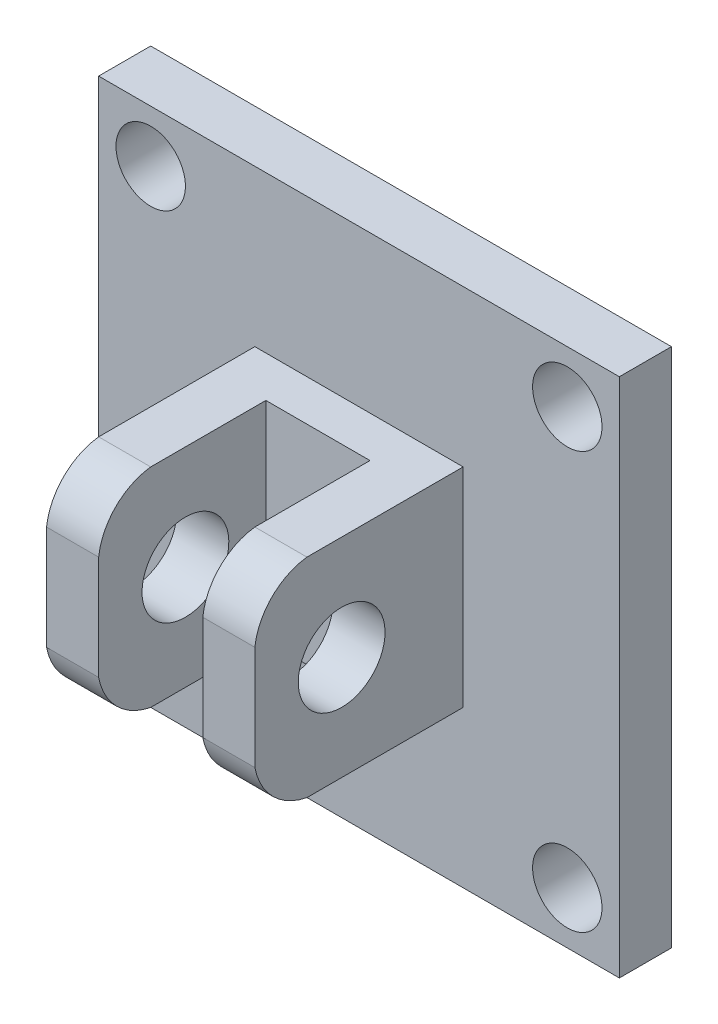
ISO-10303-21;
HEADER;
FILE_DESCRIPTION(('STEP AP214'),'2;1');
FILE_NAME('part.step','',(''),(''),'','','');
FILE_SCHEMA(('AUTOMOTIVE_DESIGN { 1 0 10303 214 1 1 1 1 }'));
ENDSEC;
DATA;
#1=APPLICATION_CONTEXT('core data for automotive mechanical design processes');
#2=APPLICATION_PROTOCOL_DEFINITION('international standard','automotive_design',2000,#1);
#3=PRODUCT_CONTEXT('',#1,'mechanical');
#4=PRODUCT('Part','Part','',(#3));
#5=PRODUCT_RELATED_PRODUCT_CATEGORY('part','',(#4));
#6=PRODUCT_DEFINITION_FORMATION('','',#4);
#7=PRODUCT_DEFINITION_CONTEXT('part definition',#1,'design');
#8=PRODUCT_DEFINITION('design','',#6,#7);
#9=PRODUCT_DEFINITION_SHAPE('','',#8);
#10=(LENGTH_UNIT() NAMED_UNIT(*) SI_UNIT(.MILLI.,.METRE.));
#11=(NAMED_UNIT(*) PLANE_ANGLE_UNIT() SI_UNIT($,.RADIAN.));
#12=(NAMED_UNIT(*) SI_UNIT($,.STERADIAN.) SOLID_ANGLE_UNIT());
#13=UNCERTAINTY_MEASURE_WITH_UNIT(LENGTH_MEASURE(1.E-05),#10,'distance_accuracy_value','');
#14=(GEOMETRIC_REPRESENTATION_CONTEXT(3) GLOBAL_UNCERTAINTY_ASSIGNED_CONTEXT((#13)) GLOBAL_UNIT_ASSIGNED_CONTEXT((#10,
#11,#12)) REPRESENTATION_CONTEXT('',''));
#15=CARTESIAN_POINT('',(0.,0.,0.));
#16=DIRECTION('',(0.,0.,1.));
#17=DIRECTION('',(1.,0.,0.));
#18=AXIS2_PLACEMENT_3D('',#15,#16,#17);
#19=CARTESIAN_POINT('',(0.,0.,12.));
#20=DIRECTION('',(0.,0.,1.));
#21=DIRECTION('',(1.,0.,0.));
#22=AXIS2_PLACEMENT_3D('',#19,#20,#21);
#23=PLANE('',#22);
#24=DIRECTION('',(-1.,0.,0.));
#25=VECTOR('',#24,1.);
#26=CARTESIAN_POINT('',(12.,-9.,12.));
#27=LINE('',#26,#25);
#28=CARTESIAN_POINT('',(3.,-9.,12.));
#29=VERTEX_POINT('',#28);
#30=CARTESIAN_POINT('',(0.,-9.,12.));
#31=VERTEX_POINT('',#30);
#32=EDGE_CURVE('E196',#29,#31,#27,.T.);
#33=ORIENTED_EDGE('',*,*,#32,.F.);
#34=DIRECTION('',(0.,1.,0.));
#35=VECTOR('',#34,1.);
#36=CARTESIAN_POINT('',(3.,-12.,12.));
#37=LINE('',#36,#35);
#38=CARTESIAN_POINT('',(3.,-3.,12.));
#39=VERTEX_POINT('',#38);
#40=EDGE_CURVE('E223',#29,#39,#37,.T.);
#41=ORIENTED_EDGE('',*,*,#40,.T.);
#42=DIRECTION('',(-1.,0.,0.));
#43=VECTOR('',#42,1.);
#44=CARTESIAN_POINT('',(12.,-3.,12.));
#45=LINE('',#44,#43);
#46=CARTESIAN_POINT('',(0.,-3.,12.));
#47=VERTEX_POINT('',#46);
#48=EDGE_CURVE('E56',#39,#47,#45,.T.);
#49=ORIENTED_EDGE('',*,*,#48,.T.);
#50=DIRECTION('',(0.,-1.,0.));
#51=VECTOR('',#50,1.);
#52=CARTESIAN_POINT('',(0.,0.,12.));
#53=LINE('',#52,#51);
#54=EDGE_CURVE('E241',#47,#31,#53,.T.);
#55=ORIENTED_EDGE('',*,*,#54,.T.);
#56=EDGE_LOOP('',(#33,#41,#49,#55));
#57=FACE_BOUND('',#56,.T.);
#58=ADVANCED_FACE('F33',(#57),#23,.T.);
#59=CARTESIAN_POINT('',(0.,0.,12.));
#60=DIRECTION('',(1.,0.,0.));
#61=DIRECTION('',(0.,1.,0.));
#62=AXIS2_PLACEMENT_3D('',#59,#60,#61);
#63=PLANE('',#62);
#64=CARTESIAN_POINT('',(0.,-6.,7.));
#65=DIRECTION('',(-1.,0.,0.));
#66=DIRECTION('',(0.,-1.,0.));
#67=AXIS2_PLACEMENT_3D('',#64,#65,#66);
#68=CIRCLE('',#67,2.5);
#69=CARTESIAN_POINT('',(0.,-8.5,7.));
#70=VERTEX_POINT('',#69);
#71=EDGE_CURVE('E188',#70,#70,#68,.T.);
#72=ORIENTED_EDGE('',*,*,#71,.F.);
#73=EDGE_LOOP('',(#72));
#74=FACE_BOUND('',#73,.T.);
#75=DIRECTION('',(0.,0.,-1.));
#76=VECTOR('',#75,1.);
#77=CARTESIAN_POINT('',(0.,-12.,12.));
#78=LINE('',#77,#76);
#79=CARTESIAN_POINT('',(0.,-12.,9.));
#80=VERTEX_POINT('',#79);
#81=CARTESIAN_POINT('',(0.,-12.,0.));
#82=VERTEX_POINT('',#81);
#83=EDGE_CURVE('E267',#80,#82,#78,.T.);
#84=ORIENTED_EDGE('',*,*,#83,.F.);
#85=CARTESIAN_POINT('',(0.,-8.28681982270568,8.28681982270568));
#86=DIRECTION('',(1.,0.,0.));
#87=DIRECTION('',(0.,1.,0.));
#88=AXIS2_PLACEMENT_3D('',#85,#86,#87);
#89=CIRCLE('',#88,3.78104919226623);
#90=EDGE_CURVE('E172',#31,#80,#89,.T.);
#91=ORIENTED_EDGE('',*,*,#90,.F.);
#92=ORIENTED_EDGE('',*,*,#54,.F.);
#93=CARTESIAN_POINT('',(0.,-3.40457410915442,8.59542589084558));
#94=DIRECTION('',(1.,0.,0.));
#95=DIRECTION('',(0.,1.,0.));
#96=AXIS2_PLACEMENT_3D('',#93,#94,#95);
#97=CIRCLE('',#96,3.42852812071342);
#98=CARTESIAN_POINT('',(0.,0.,9.));
#99=VERTEX_POINT('',#98);
#100=EDGE_CURVE('E183',#99,#47,#97,.T.);
#101=ORIENTED_EDGE('',*,*,#100,.F.);
#102=DIRECTION('',(0.,0.,-1.));
#103=VECTOR('',#102,1.);
#104=CARTESIAN_POINT('',(0.,0.,12.));
#105=LINE('',#104,#103);
#106=CARTESIAN_POINT('',(0.,0.,0.));
#107=VERTEX_POINT('',#106);
#108=EDGE_CURVE('E248',#99,#107,#105,.T.);
#109=ORIENTED_EDGE('',*,*,#108,.T.);
#110=DIRECTION('',(0.,-1.,0.));
#111=VECTOR('',#110,1.);
#112=CARTESIAN_POINT('',(0.,0.,0.));
#113=LINE('',#112,#111);
#114=EDGE_CURVE('E232',#107,#82,#113,.T.);
#115=ORIENTED_EDGE('',*,*,#114,.T.);
#116=EDGE_LOOP('',(#84,#91,#92,#101,#109,#115));
#117=FACE_BOUND('',#116,.T.);
#118=ADVANCED_FACE('F35',(#74,#117),#63,.F.);
#119=CARTESIAN_POINT('',(0.,-12.,12.));
#120=DIRECTION('',(0.,1.,0.));
#121=DIRECTION('',(0.,0.,1.));
#122=AXIS2_PLACEMENT_3D('',#119,#120,#121);
#123=PLANE('',#122);
#124=DIRECTION('',(0.,0.,-1.));
#125=VECTOR('',#124,1.);
#126=CARTESIAN_POINT('',(12.,-12.,12.));
#127=LINE('',#126,#125);
#128=CARTESIAN_POINT('',(12.,-12.,9.));
#129=VERTEX_POINT('',#128);
#130=CARTESIAN_POINT('',(12.,-12.,0.));
#131=VERTEX_POINT('',#130);
#132=EDGE_CURVE('E264',#129,#131,#127,.T.);
#133=ORIENTED_EDGE('',*,*,#132,.F.);
#134=DIRECTION('',(-1.,0.,0.));
#135=VECTOR('',#134,1.);
#136=CARTESIAN_POINT('',(12.,-12.,9.));
#137=LINE('',#136,#135);
#138=CARTESIAN_POINT('',(9.,-12.,9.));
#139=VERTEX_POINT('',#138);
#140=EDGE_CURVE('E197',#129,#139,#137,.T.);
#141=ORIENTED_EDGE('',*,*,#140,.T.);
#142=DIRECTION('',(0.,0.,-1.));
#143=VECTOR('',#142,1.);
#144=CARTESIAN_POINT('',(9.,-12.,12.));
#145=LINE('',#144,#143);
#146=CARTESIAN_POINT('',(9.,-12.,2.3658455900202));
#147=VERTEX_POINT('',#146);
#148=EDGE_CURVE('E217',#139,#147,#145,.T.);
#149=ORIENTED_EDGE('',*,*,#148,.T.);
#150=DIRECTION('',(-1.,0.,0.));
#151=VECTOR('',#150,1.);
#152=CARTESIAN_POINT('',(3.,-12.,2.3658455900202));
#153=LINE('',#152,#151);
#154=CARTESIAN_POINT('',(3.,-12.,2.3658455900202));
#155=VERTEX_POINT('',#154);
#156=EDGE_CURVE('E220',#147,#155,#153,.T.);
#157=ORIENTED_EDGE('',*,*,#156,.T.);
#158=DIRECTION('',(0.,0.,1.));
#159=VECTOR('',#158,1.);
#160=CARTESIAN_POINT('',(3.,-12.,12.));
#161=LINE('',#160,#159);
#162=CARTESIAN_POINT('',(3.,-12.,9.));
#163=VERTEX_POINT('',#162);
#164=EDGE_CURVE('E214',#155,#163,#161,.T.);
#165=ORIENTED_EDGE('',*,*,#164,.T.);
#166=EDGE_CURVE('E48',#163,#80,#137,.T.);
#167=ORIENTED_EDGE('',*,*,#166,.T.);
#168=ORIENTED_EDGE('',*,*,#83,.T.);
#169=DIRECTION('',(1.,0.,0.));
#170=VECTOR('',#169,1.);
#171=CARTESIAN_POINT('',(0.,-12.,0.));
#172=LINE('',#171,#170);
#173=EDGE_CURVE('E251',#82,#131,#172,.T.);
#174=ORIENTED_EDGE('',*,*,#173,.T.);
#175=EDGE_LOOP('',(#133,#141,#149,#157,#165,#167,#168,#174));
#176=FACE_BOUND('',#175,.T.);
#177=ADVANCED_FACE('F293',(#176),#123,.F.);
#178=CARTESIAN_POINT('',(12.,0.,12.));
#179=DIRECTION('',(-1.,0.,0.));
#180=DIRECTION('',(0.,-1.,0.));
#181=AXIS2_PLACEMENT_3D('',#178,#179,#180);
#182=PLANE('',#181);
#183=CARTESIAN_POINT('',(12.,-6.,7.));
#184=DIRECTION('',(-1.,0.,0.));
#185=DIRECTION('',(0.,-1.,0.));
#186=AXIS2_PLACEMENT_3D('',#183,#184,#185);
#187=CIRCLE('',#186,2.5);
#188=CARTESIAN_POINT('',(12.,-8.5,7.));
#189=VERTEX_POINT('',#188);
#190=EDGE_CURVE('E200',#189,#189,#187,.T.);
#191=ORIENTED_EDGE('',*,*,#190,.T.);
#192=EDGE_LOOP('',(#191));
#193=FACE_BOUND('',#192,.T.);
#194=DIRECTION('',(0.,1.,0.));
#195=VECTOR('',#194,1.);
#196=CARTESIAN_POINT('',(12.,0.,12.));
#197=LINE('',#196,#195);
#198=CARTESIAN_POINT('',(12.,-9.,12.));
#199=VERTEX_POINT('',#198);
#200=CARTESIAN_POINT('',(12.,-3.,12.));
#201=VERTEX_POINT('',#200);
#202=EDGE_CURVE('E244',#199,#201,#197,.T.);
#203=ORIENTED_EDGE('',*,*,#202,.F.);
#204=CARTESIAN_POINT('',(12.,-8.28681982270567,8.28681982270568));
#205=DIRECTION('',(1.,0.,0.));
#206=DIRECTION('',(0.,1.,0.));
#207=AXIS2_PLACEMENT_3D('',#204,#205,#206);
#208=CIRCLE('',#207,3.78104919226623);
#209=EDGE_CURVE('E174',#199,#129,#208,.T.);
#210=ORIENTED_EDGE('',*,*,#209,.T.);
#211=ORIENTED_EDGE('',*,*,#132,.T.);
#212=DIRECTION('',(0.,1.,0.));
#213=VECTOR('',#212,1.);
#214=CARTESIAN_POINT('',(12.,0.,0.));
#215=LINE('',#214,#213);
#216=CARTESIAN_POINT('',(12.,0.,0.));
#217=VERTEX_POINT('',#216);
#218=EDGE_CURVE('E254',#131,#217,#215,.T.);
#219=ORIENTED_EDGE('',*,*,#218,.T.);
#220=DIRECTION('',(0.,0.,-1.));
#221=VECTOR('',#220,1.);
#222=CARTESIAN_POINT('',(12.,0.,12.));
#223=LINE('',#222,#221);
#224=CARTESIAN_POINT('',(12.,0.,9.));
#225=VERTEX_POINT('',#224);
#226=EDGE_CURVE('E261',#225,#217,#223,.T.);
#227=ORIENTED_EDGE('',*,*,#226,.F.);
#228=CARTESIAN_POINT('',(12.,-3.40457410915442,8.59542589084558));
#229=DIRECTION('',(1.,0.,0.));
#230=DIRECTION('',(0.,1.,0.));
#231=AXIS2_PLACEMENT_3D('',#228,#229,#230);
#232=CIRCLE('',#231,3.42852812071342);
#233=EDGE_CURVE('E180',#225,#201,#232,.T.);
#234=ORIENTED_EDGE('',*,*,#233,.T.);
#235=EDGE_LOOP('',(#203,#210,#211,#219,#227,#234));
#236=FACE_BOUND('',#235,.T.);
#237=ADVANCED_FACE('F299',(#193,#236),#182,.F.);
#238=CARTESIAN_POINT('',(0.,0.,12.));
#239=DIRECTION('',(0.,-1.,0.));
#240=DIRECTION('',(0.,0.,-1.));
#241=AXIS2_PLACEMENT_3D('',#238,#239,#240);
#242=PLANE('',#241);
#243=ORIENTED_EDGE('',*,*,#108,.F.);
#244=DIRECTION('',(-1.,0.,0.));
#245=VECTOR('',#244,1.);
#246=CARTESIAN_POINT('',(12.,0.,9.));
#247=LINE('',#246,#245);
#248=CARTESIAN_POINT('',(3.,0.,9.));
#249=VERTEX_POINT('',#248);
#250=EDGE_CURVE('E189',#249,#99,#247,.T.);
#251=ORIENTED_EDGE('',*,*,#250,.F.);
#252=DIRECTION('',(0.,0.,1.));
#253=VECTOR('',#252,1.);
#254=CARTESIAN_POINT('',(3.,0.,12.));
#255=LINE('',#254,#253);
#256=CARTESIAN_POINT('',(3.,0.,2.3658455900202));
#257=VERTEX_POINT('',#256);
#258=EDGE_CURVE('E213',#257,#249,#255,.T.);
#259=ORIENTED_EDGE('',*,*,#258,.F.);
#260=DIRECTION('',(-1.,0.,0.));
#261=VECTOR('',#260,1.);
#262=CARTESIAN_POINT('',(3.,0.,2.3658455900202));
#263=LINE('',#262,#261);
#264=CARTESIAN_POINT('',(9.,0.,2.3658455900202));
#265=VERTEX_POINT('',#264);
#266=EDGE_CURVE('E218',#265,#257,#263,.T.);
#267=ORIENTED_EDGE('',*,*,#266,.F.);
#268=DIRECTION('',(0.,0.,-1.));
#269=VECTOR('',#268,1.);
#270=CARTESIAN_POINT('',(9.,0.,12.));
#271=LINE('',#270,#269);
#272=CARTESIAN_POINT('',(9.,0.,9.));
#273=VERTEX_POINT('',#272);
#274=EDGE_CURVE('E226',#273,#265,#271,.T.);
#275=ORIENTED_EDGE('',*,*,#274,.F.);
#276=EDGE_CURVE('E186',#225,#273,#247,.T.);
#277=ORIENTED_EDGE('',*,*,#276,.F.);
#278=ORIENTED_EDGE('',*,*,#226,.T.);
#279=DIRECTION('',(-1.,0.,0.));
#280=VECTOR('',#279,1.);
#281=CARTESIAN_POINT('',(0.,0.,0.));
#282=LINE('',#281,#280);
#283=EDGE_CURVE('E245',#217,#107,#282,.T.);
#284=ORIENTED_EDGE('',*,*,#283,.T.);
#285=EDGE_LOOP('',(#243,#251,#259,#267,#275,#277,#278,#284));
#286=FACE_BOUND('',#285,.T.);
#287=ADVANCED_FACE('F283',(#286),#242,.F.);
#288=CARTESIAN_POINT('',(9.,-9.,12.));
#289=VERTEX_POINT('',#288);
#290=EDGE_CURVE('E185',#199,#289,#27,.T.);
#291=ORIENTED_EDGE('',*,*,#290,.F.);
#292=ORIENTED_EDGE('',*,*,#202,.T.);
#293=CARTESIAN_POINT('',(9.,-3.,12.));
#294=VERTEX_POINT('',#293);
#295=EDGE_CURVE('E190',#201,#294,#45,.T.);
#296=ORIENTED_EDGE('',*,*,#295,.T.);
#297=DIRECTION('',(0.,1.,0.));
#298=VECTOR('',#297,1.);
#299=CARTESIAN_POINT('',(9.,-12.,12.));
#300=LINE('',#299,#298);
#301=EDGE_CURVE('E236',#289,#294,#300,.T.);
#302=ORIENTED_EDGE('',*,*,#301,.F.);
#303=EDGE_LOOP('',(#291,#292,#296,#302));
#304=FACE_BOUND('',#303,.T.);
#305=ADVANCED_FACE('F301',(#304),#23,.T.);
#306=CARTESIAN_POINT('',(3.,-12.,12.));
#307=DIRECTION('',(-1.,0.,0.));
#308=DIRECTION('',(0.,0.,1.));
#309=AXIS2_PLACEMENT_3D('',#306,#307,#308);
#310=PLANE('',#309);
#311=CARTESIAN_POINT('',(3.,-6.,7.));
#312=DIRECTION('',(-1.,0.,0.));
#313=DIRECTION('',(0.,0.,1.));
#314=AXIS2_PLACEMENT_3D('',#311,#312,#313);
#315=CIRCLE('',#314,2.5);
#316=CARTESIAN_POINT('',(3.,-8.5,7.));
#317=VERTEX_POINT('',#316);
#318=EDGE_CURVE('E206',#317,#317,#315,.T.);
#319=ORIENTED_EDGE('',*,*,#318,.T.);
#320=EDGE_LOOP('',(#319));
#321=FACE_BOUND('',#320,.T.);
#322=ORIENTED_EDGE('',*,*,#40,.F.);
#323=CARTESIAN_POINT('',(3.,-8.28681982270568,8.28681982270568));
#324=DIRECTION('',(-1.,0.,0.));
#325=DIRECTION('',(0.,0.,1.));
#326=AXIS2_PLACEMENT_3D('',#323,#324,#325);
#327=CIRCLE('',#326,3.78104919226623);
#328=EDGE_CURVE('E211',#29,#163,#327,.F.);
#329=ORIENTED_EDGE('',*,*,#328,.T.);
#330=ORIENTED_EDGE('',*,*,#164,.F.);
#331=DIRECTION('',(0.,1.,0.));
#332=VECTOR('',#331,1.);
#333=CARTESIAN_POINT('',(3.,-12.,2.3658455900202));
#334=LINE('',#333,#332);
#335=EDGE_CURVE('E230',#155,#257,#334,.T.);
#336=ORIENTED_EDGE('',*,*,#335,.T.);
#337=ORIENTED_EDGE('',*,*,#258,.T.);
#338=CARTESIAN_POINT('',(3.,-3.40457410915442,8.59542589084558));
#339=DIRECTION('',(-1.,0.,0.));
#340=DIRECTION('',(0.,0.,1.));
#341=AXIS2_PLACEMENT_3D('',#338,#339,#340);
#342=CIRCLE('',#341,3.42852812071342);
#343=EDGE_CURVE('E209',#249,#39,#342,.F.);
#344=ORIENTED_EDGE('',*,*,#343,.T.);
#345=EDGE_LOOP('',(#322,#329,#330,#336,#337,#344));
#346=FACE_BOUND('',#345,.T.);
#347=ADVANCED_FACE('F329',(#321,#346),#310,.F.);
#348=CARTESIAN_POINT('',(3.,-12.,2.3658455900202));
#349=DIRECTION('',(0.,0.,-1.));
#350=DIRECTION('',(-1.,0.,0.));
#351=AXIS2_PLACEMENT_3D('',#348,#349,#350);
#352=PLANE('',#351);
#353=ORIENTED_EDGE('',*,*,#266,.T.);
#354=ORIENTED_EDGE('',*,*,#335,.F.);
#355=ORIENTED_EDGE('',*,*,#156,.F.);
#356=DIRECTION('',(0.,1.,0.));
#357=VECTOR('',#356,1.);
#358=CARTESIAN_POINT('',(9.,-12.,2.3658455900202));
#359=LINE('',#358,#357);
#360=EDGE_CURVE('E233',#147,#265,#359,.T.);
#361=ORIENTED_EDGE('',*,*,#360,.T.);
#362=EDGE_LOOP('',(#353,#354,#355,#361));
#363=FACE_BOUND('',#362,.T.);
#364=ADVANCED_FACE('F288',(#363),#352,.F.);
#365=CARTESIAN_POINT('',(9.,-12.,12.));
#366=DIRECTION('',(1.,0.,0.));
#367=DIRECTION('',(0.,0.,-1.));
#368=AXIS2_PLACEMENT_3D('',#365,#366,#367);
#369=PLANE('',#368);
#370=CARTESIAN_POINT('',(9.,-6.,7.));
#371=DIRECTION('',(1.,0.,0.));
#372=DIRECTION('',(0.,0.,-1.));
#373=AXIS2_PLACEMENT_3D('',#370,#371,#372);
#374=CIRCLE('',#373,2.5);
#375=CARTESIAN_POINT('',(9.,-8.5,7.));
#376=VERTEX_POINT('',#375);
#377=EDGE_CURVE('E203',#376,#376,#374,.T.);
#378=ORIENTED_EDGE('',*,*,#377,.T.);
#379=EDGE_LOOP('',(#378));
#380=FACE_BOUND('',#379,.T.);
#381=ORIENTED_EDGE('',*,*,#148,.F.);
#382=CARTESIAN_POINT('',(9.,-8.28681982270567,8.28681982270568));
#383=DIRECTION('',(1.,0.,0.));
#384=DIRECTION('',(0.,0.,-1.));
#385=AXIS2_PLACEMENT_3D('',#382,#383,#384);
#386=CIRCLE('',#385,3.78104919226623);
#387=EDGE_CURVE('E11',#139,#289,#386,.F.);
#388=ORIENTED_EDGE('',*,*,#387,.T.);
#389=ORIENTED_EDGE('',*,*,#301,.T.);
#390=CARTESIAN_POINT('',(9.,-3.40457410915442,8.59542589084558));
#391=DIRECTION('',(1.,0.,0.));
#392=DIRECTION('',(0.,0.,-1.));
#393=AXIS2_PLACEMENT_3D('',#390,#391,#392);
#394=CIRCLE('',#393,3.42852812071342);
#395=EDGE_CURVE('E41',#294,#273,#394,.F.);
#396=ORIENTED_EDGE('',*,*,#395,.T.);
#397=ORIENTED_EDGE('',*,*,#274,.T.);
#398=ORIENTED_EDGE('',*,*,#360,.F.);
#399=EDGE_LOOP('',(#381,#388,#389,#396,#397,#398));
#400=FACE_BOUND('',#399,.T.);
#401=ADVANCED_FACE('F275',(#380,#400),#369,.F.);
#402=CARTESIAN_POINT('',(12.,-6.,7.));
#403=DIRECTION('',(-1.,0.,0.));
#404=DIRECTION('',(0.,-1.,0.));
#405=AXIS2_PLACEMENT_3D('',#402,#403,#404);
#406=CYLINDRICAL_SURFACE('',#405,2.5);
#407=CARTESIAN_POINT('',(12.,-8.5,7.));
#408=CARTESIAN_POINT('',(11.96875,-8.5,7.));
#409=CARTESIAN_POINT('',(11.9375,-8.5,7.));
#410=CARTESIAN_POINT('',(11.875,-8.5,7.));
#411=CARTESIAN_POINT('',(11.84375,-8.5,7.));
#412=CARTESIAN_POINT('',(11.78125,-8.5,7.));
#413=CARTESIAN_POINT('',(11.75,-8.5,7.));
#414=CARTESIAN_POINT('',(11.6875,-8.5,7.));
#415=CARTESIAN_POINT('',(11.65625,-8.5,7.));
#416=CARTESIAN_POINT('',(11.59375,-8.5,7.));
#417=CARTESIAN_POINT('',(11.5625,-8.5,7.));
#418=CARTESIAN_POINT('',(11.5,-8.5,7.));
#419=CARTESIAN_POINT('',(11.46875,-8.5,7.));
#420=CARTESIAN_POINT('',(11.40625,-8.5,7.));
#421=CARTESIAN_POINT('',(11.375,-8.5,7.));
#422=CARTESIAN_POINT('',(11.3125,-8.5,7.));
#423=CARTESIAN_POINT('',(11.28125,-8.5,7.));
#424=CARTESIAN_POINT('',(11.21875,-8.5,7.));
#425=CARTESIAN_POINT('',(11.1875,-8.5,7.));
#426=CARTESIAN_POINT('',(11.125,-8.5,7.));
#427=CARTESIAN_POINT('',(11.09375,-8.5,7.));
#428=CARTESIAN_POINT('',(11.03125,-8.5,7.));
#429=CARTESIAN_POINT('',(11.,-8.5,7.));
#430=CARTESIAN_POINT('',(10.9375,-8.5,7.));
#431=CARTESIAN_POINT('',(10.90625,-8.5,7.));
#432=CARTESIAN_POINT('',(10.84375,-8.5,7.));
#433=CARTESIAN_POINT('',(10.8125,-8.5,7.));
#434=CARTESIAN_POINT('',(10.75,-8.5,7.));
#435=CARTESIAN_POINT('',(10.71875,-8.5,7.));
#436=CARTESIAN_POINT('',(10.65625,-8.5,7.));
#437=CARTESIAN_POINT('',(10.625,-8.5,7.));
#438=CARTESIAN_POINT('',(10.5625,-8.5,7.));
#439=CARTESIAN_POINT('',(10.53125,-8.5,7.));
#440=CARTESIAN_POINT('',(10.46875,-8.5,7.));
#441=CARTESIAN_POINT('',(10.4375,-8.5,7.));
#442=CARTESIAN_POINT('',(10.375,-8.5,7.));
#443=CARTESIAN_POINT('',(10.34375,-8.5,7.));
#444=CARTESIAN_POINT('',(10.28125,-8.5,7.));
#445=CARTESIAN_POINT('',(10.25,-8.5,7.));
#446=CARTESIAN_POINT('',(10.1875,-8.5,7.));
#447=CARTESIAN_POINT('',(10.15625,-8.5,7.));
#448=CARTESIAN_POINT('',(10.09375,-8.5,7.));
#449=CARTESIAN_POINT('',(10.0625,-8.5,7.));
#450=CARTESIAN_POINT('',(10.,-8.5,7.));
#451=CARTESIAN_POINT('',(9.96875,-8.5,7.));
#452=CARTESIAN_POINT('',(9.90625,-8.5,7.));
#453=CARTESIAN_POINT('',(9.875,-8.5,7.));
#454=CARTESIAN_POINT('',(9.8125,-8.5,7.));
#455=CARTESIAN_POINT('',(9.78125,-8.5,7.));
#456=CARTESIAN_POINT('',(9.71875,-8.5,7.));
#457=CARTESIAN_POINT('',(9.6875,-8.5,7.));
#458=CARTESIAN_POINT('',(9.625,-8.5,7.));
#459=CARTESIAN_POINT('',(9.59375,-8.5,7.));
#460=CARTESIAN_POINT('',(9.53125,-8.5,7.));
#461=CARTESIAN_POINT('',(9.5,-8.5,7.));
#462=CARTESIAN_POINT('',(9.4375,-8.5,7.));
#463=CARTESIAN_POINT('',(9.40625,-8.5,7.));
#464=CARTESIAN_POINT('',(9.34375,-8.5,7.));
#465=CARTESIAN_POINT('',(9.3125,-8.5,7.));
#466=CARTESIAN_POINT('',(9.25,-8.5,7.));
#467=CARTESIAN_POINT('',(9.21875,-8.5,7.));
#468=CARTESIAN_POINT('',(9.15625,-8.5,7.));
#469=CARTESIAN_POINT('',(9.125,-8.5,7.));
#470=CARTESIAN_POINT('',(9.0625,-8.5,7.));
#471=CARTESIAN_POINT('',(9.03125,-8.5,7.));
#472=CARTESIAN_POINT('',(9.,-8.5,7.));
#473=B_SPLINE_CURVE_WITH_KNOTS('',3,(#407,#408,#409,#410,#411,#412,#413,#414,#415,#416,#417,
#418,#419,#420,#421,#422,#423,#424,#425,#426,#427,#428,#429,#430,#431,#432,#433,#434,#435,#436,
#437,#438,#439,#440,#441,#442,#443,#444,#445,#446,#447,#448,#449,#450,#451,#452,#453,#454,#455,
#456,#457,#458,#459,#460,#461,#462,#463,#464,#465,#466,#467,#468,#469,#470,#471,#472),
.UNSPECIFIED.,.F.,.F.,(4,2,2,2,2,2,2,2,2,2,2,2,2,2,2,2,2,2,2,2,2,2,2,2,2,2,2,2,2,2,2,2,4),(0.,
0.0937500000000001,0.1875,0.28125,0.375,0.46875,0.5625,0.656250000000001,0.750000000000001,
0.843750000000001,0.937500000000001,1.03125,1.125,1.21875,1.3125,1.40625,1.5,1.59375,1.6875,
1.78125,1.875,1.96875,2.0625,2.15625,2.25,2.34375,2.4375,2.53125,2.625,2.71875,2.8125,2.90625,
3.),.UNSPECIFIED.);
#474=EDGE_CURVE('BSEAM304',#189,#376,#473,.T.);
#475=ORIENTED_EDGE('',*,*,#190,.F.);
#476=ORIENTED_EDGE('',*,*,#377,.F.);
#477=ORIENTED_EDGE('',*,*,#474,.T.);
#478=ORIENTED_EDGE('',*,*,#474,.F.);
#479=EDGE_LOOP('',(#475,#477,#476,#478));
#480=FACE_BOUND('',#479,.T.);
#481=ADVANCED_FACE('F304',(#480),#406,.F.);
#482=CARTESIAN_POINT('',(12.,-3.40457410915442,8.59542589084558));
#483=DIRECTION('',(-1.,0.,0.));
#484=DIRECTION('',(0.,-1.,0.));
#485=AXIS2_PLACEMENT_3D('',#482,#483,#484);
#486=CYLINDRICAL_SURFACE('',#485,3.42852812071342);
#487=ORIENTED_EDGE('',*,*,#295,.F.);
#488=ORIENTED_EDGE('',*,*,#233,.F.);
#489=ORIENTED_EDGE('',*,*,#276,.T.);
#490=ORIENTED_EDGE('',*,*,#395,.F.);
#491=EDGE_LOOP('',(#487,#488,#489,#490));
#492=FACE_BOUND('',#491,.T.);
#493=ADVANCED_FACE('F302',(#492),#486,.T.);
#494=CARTESIAN_POINT('',(12.,-8.28681982270567,8.28681982270568));
#495=DIRECTION('',(-1.,0.,0.));
#496=DIRECTION('',(0.,-1.,0.));
#497=AXIS2_PLACEMENT_3D('',#494,#495,#496);
#498=CYLINDRICAL_SURFACE('',#497,3.78104919226623);
#499=ORIENTED_EDGE('',*,*,#140,.F.);
#500=ORIENTED_EDGE('',*,*,#209,.F.);
#501=ORIENTED_EDGE('',*,*,#290,.T.);
#502=ORIENTED_EDGE('',*,*,#387,.F.);
#503=EDGE_LOOP('',(#499,#500,#501,#502));
#504=FACE_BOUND('',#503,.T.);
#505=ADVANCED_FACE('F295',(#504),#498,.T.);
#506=CARTESIAN_POINT('',(0.,-8.5,7.));
#507=CARTESIAN_POINT('',(0.03125,-8.5,7.));
#508=CARTESIAN_POINT('',(0.0625000000000001,-8.5,7.));
#509=CARTESIAN_POINT('',(0.125,-8.5,7.));
#510=CARTESIAN_POINT('',(0.15625,-8.5,7.));
#511=CARTESIAN_POINT('',(0.21875,-8.5,7.));
#512=CARTESIAN_POINT('',(0.25,-8.5,7.));
#513=CARTESIAN_POINT('',(0.3125,-8.5,7.));
#514=CARTESIAN_POINT('',(0.34375,-8.5,7.));
#515=CARTESIAN_POINT('',(0.40625,-8.5,7.));
#516=CARTESIAN_POINT('',(0.4375,-8.5,7.));
#517=CARTESIAN_POINT('',(0.5,-8.5,7.));
#518=CARTESIAN_POINT('',(0.53125,-8.5,7.));
#519=CARTESIAN_POINT('',(0.593750000000001,-8.5,7.));
#520=CARTESIAN_POINT('',(0.625000000000001,-8.5,7.));
#521=CARTESIAN_POINT('',(0.687500000000001,-8.5,7.));
#522=CARTESIAN_POINT('',(0.718750000000001,-8.5,7.));
#523=CARTESIAN_POINT('',(0.78125,-8.5,7.));
#524=CARTESIAN_POINT('',(0.8125,-8.5,7.));
#525=CARTESIAN_POINT('',(0.874999999999999,-8.5,7.));
#526=CARTESIAN_POINT('',(0.906249999999999,-8.5,7.));
#527=CARTESIAN_POINT('',(0.968749999999999,-8.5,7.));
#528=CARTESIAN_POINT('',(0.999999999999999,-8.5,7.));
#529=CARTESIAN_POINT('',(1.0625,-8.5,7.));
#530=CARTESIAN_POINT('',(1.09375,-8.5,7.));
#531=CARTESIAN_POINT('',(1.15625,-8.5,7.));
#532=CARTESIAN_POINT('',(1.1875,-8.5,7.));
#533=CARTESIAN_POINT('',(1.25,-8.5,7.));
#534=CARTESIAN_POINT('',(1.28125,-8.5,7.));
#535=CARTESIAN_POINT('',(1.34375,-8.5,7.));
#536=CARTESIAN_POINT('',(1.375,-8.5,7.));
#537=CARTESIAN_POINT('',(1.4375,-8.5,7.));
#538=CARTESIAN_POINT('',(1.46875,-8.5,7.));
#539=CARTESIAN_POINT('',(1.53125,-8.5,7.));
#540=CARTESIAN_POINT('',(1.5625,-8.5,7.));
#541=CARTESIAN_POINT('',(1.625,-8.5,7.));
#542=CARTESIAN_POINT('',(1.65625,-8.5,7.));
#543=CARTESIAN_POINT('',(1.71875,-8.5,7.));
#544=CARTESIAN_POINT('',(1.75,-8.5,7.));
#545=CARTESIAN_POINT('',(1.8125,-8.5,7.));
#546=CARTESIAN_POINT('',(1.84375,-8.5,7.));
#547=CARTESIAN_POINT('',(1.90625,-8.5,7.));
#548=CARTESIAN_POINT('',(1.9375,-8.5,7.));
#549=CARTESIAN_POINT('',(2.,-8.5,7.));
#550=CARTESIAN_POINT('',(2.03125,-8.5,7.));
#551=CARTESIAN_POINT('',(2.09375,-8.5,7.));
#552=CARTESIAN_POINT('',(2.125,-8.5,7.));
#553=CARTESIAN_POINT('',(2.1875,-8.5,7.));
#554=CARTESIAN_POINT('',(2.21875,-8.5,7.));
#555=CARTESIAN_POINT('',(2.28125,-8.5,7.));
#556=CARTESIAN_POINT('',(2.3125,-8.5,7.));
#557=CARTESIAN_POINT('',(2.375,-8.5,7.));
#558=CARTESIAN_POINT('',(2.40625,-8.5,7.));
#559=CARTESIAN_POINT('',(2.46875,-8.5,7.));
#560=CARTESIAN_POINT('',(2.5,-8.5,7.));
#561=CARTESIAN_POINT('',(2.5625,-8.5,7.));
#562=CARTESIAN_POINT('',(2.59375,-8.5,7.));
#563=CARTESIAN_POINT('',(2.65625,-8.5,7.));
#564=CARTESIAN_POINT('',(2.6875,-8.5,7.));
#565=CARTESIAN_POINT('',(2.75,-8.5,7.));
#566=CARTESIAN_POINT('',(2.78125,-8.5,7.));
#567=CARTESIAN_POINT('',(2.84375,-8.5,7.));
#568=CARTESIAN_POINT('',(2.875,-8.5,7.));
#569=CARTESIAN_POINT('',(2.9375,-8.5,7.));
#570=CARTESIAN_POINT('',(2.96875,-8.5,7.));
#571=CARTESIAN_POINT('',(3.,-8.5,7.));
#572=B_SPLINE_CURVE_WITH_KNOTS('',3,(#506,#507,#508,#509,#510,#511,#512,#513,#514,#515,#516,
#517,#518,#519,#520,#521,#522,#523,#524,#525,#526,#527,#528,#529,#530,#531,#532,#533,#534,#535,
#536,#537,#538,#539,#540,#541,#542,#543,#544,#545,#546,#547,#548,#549,#550,#551,#552,#553,#554,
#555,#556,#557,#558,#559,#560,#561,#562,#563,#564,#565,#566,#567,#568,#569,#570,#571),
.UNSPECIFIED.,.F.,.F.,(4,2,2,2,2,2,2,2,2,2,2,2,2,2,2,2,2,2,2,2,2,2,2,2,2,2,2,2,2,2,2,2,4),(0.,
0.0937500000000001,0.1875,0.28125,0.375,0.46875,0.5625,0.656250000000001,0.750000000000001,
0.843749999999999,0.937499999999999,1.03125,1.125,1.21875,1.3125,1.40625,1.5,1.59375,1.6875,
1.78125,1.875,1.96875,2.0625,2.15625,2.25,2.34375,2.4375,2.53125,2.625,2.71875,2.8125,2.90625,
3.),.UNSPECIFIED.);
#573=EDGE_CURVE('BSEAM311',#70,#317,#572,.T.);
#574=ORIENTED_EDGE('',*,*,#71,.T.);
#575=ORIENTED_EDGE('',*,*,#318,.F.);
#576=ORIENTED_EDGE('',*,*,#573,.T.);
#577=ORIENTED_EDGE('',*,*,#573,.F.);
#578=EDGE_LOOP('',(#574,#576,#575,#577));
#579=FACE_BOUND('',#578,.T.);
#580=ADVANCED_FACE('F311',(#579),#406,.F.);
#581=ORIENTED_EDGE('',*,*,#250,.T.);
#582=ORIENTED_EDGE('',*,*,#100,.T.);
#583=ORIENTED_EDGE('',*,*,#48,.F.);
#584=ORIENTED_EDGE('',*,*,#343,.F.);
#585=EDGE_LOOP('',(#581,#582,#583,#584));
#586=FACE_BOUND('',#585,.T.);
#587=ADVANCED_FACE('F306',(#586),#486,.T.);
#588=ORIENTED_EDGE('',*,*,#32,.T.);
#589=ORIENTED_EDGE('',*,*,#90,.T.);
#590=ORIENTED_EDGE('',*,*,#166,.F.);
#591=ORIENTED_EDGE('',*,*,#328,.F.);
#592=EDGE_LOOP('',(#588,#589,#590,#591));
#593=FACE_BOUND('',#592,.T.);
#594=ADVANCED_FACE('F313',(#593),#498,.T.);
#595=CARTESIAN_POINT('',(0.,0.,-3.));
#596=DIRECTION('',(0.,0.,-1.));
#597=DIRECTION('',(-1.,0.,0.));
#598=AXIS2_PLACEMENT_3D('',#595,#596,#597);
#599=PLANE('',#598);
#600=CARTESIAN_POINT('',(18.,-18.,-3.));
#601=DIRECTION('',(0.,0.,-1.));
#602=DIRECTION('',(-1.,0.,0.));
#603=AXIS2_PLACEMENT_3D('',#600,#601,#602);
#604=CIRCLE('',#603,2.);
#605=CARTESIAN_POINT('',(16.,-18.,-3.));
#606=VERTEX_POINT('',#605);
#607=EDGE_CURVE('E466',#606,#606,#604,.T.);
#608=ORIENTED_EDGE('',*,*,#607,.F.);
#609=EDGE_LOOP('',(#608));
#610=FACE_BOUND('',#609,.T.);
#611=CARTESIAN_POINT('',(18.,6.,-3.));
#612=DIRECTION('',(0.,0.,-1.));
#613=DIRECTION('',(-1.,0.,0.));
#614=AXIS2_PLACEMENT_3D('',#611,#612,#613);
#615=CIRCLE('',#614,2.);
#616=CARTESIAN_POINT('',(16.,6.,-3.));
#617=VERTEX_POINT('',#616);
#618=EDGE_CURVE('E478',#617,#617,#615,.T.);
#619=ORIENTED_EDGE('',*,*,#618,.F.);
#620=EDGE_LOOP('',(#619));
#621=FACE_BOUND('',#620,.T.);
#622=DIRECTION('',(0.,-1.,0.));
#623=VECTOR('',#622,1.);
#624=CARTESIAN_POINT('',(21.,9.,-3.));
#625=LINE('',#624,#623);
#626=CARTESIAN_POINT('',(21.,9.,-3.));
#627=VERTEX_POINT('',#626);
#628=CARTESIAN_POINT('',(21.,-21.,-3.));
#629=VERTEX_POINT('',#628);
#630=EDGE_CURVE('E157',#627,#629,#625,.T.);
#631=ORIENTED_EDGE('',*,*,#630,.T.);
#632=DIRECTION('',(-1.,0.,0.));
#633=VECTOR('',#632,1.);
#634=CARTESIAN_POINT('',(21.,-21.,-3.));
#635=LINE('',#634,#633);
#636=CARTESIAN_POINT('',(-9.00000000000001,-21.,-3.));
#637=VERTEX_POINT('',#636);
#638=EDGE_CURVE('E146',#629,#637,#635,.T.);
#639=ORIENTED_EDGE('',*,*,#638,.T.);
#640=DIRECTION('',(0.,1.,0.));
#641=VECTOR('',#640,1.);
#642=CARTESIAN_POINT('',(-9.,9.,-3.));
#643=LINE('',#642,#641);
#644=CARTESIAN_POINT('',(-9.,9.,-3.));
#645=VERTEX_POINT('',#644);
#646=EDGE_CURVE('E156',#637,#645,#643,.T.);
#647=ORIENTED_EDGE('',*,*,#646,.T.);
#648=DIRECTION('',(1.,0.,0.));
#649=VECTOR('',#648,1.);
#650=CARTESIAN_POINT('',(21.,9.,-3.));
#651=LINE('',#650,#649);
#652=EDGE_CURVE('E163',#645,#627,#651,.T.);
#653=ORIENTED_EDGE('',*,*,#652,.T.);
#654=EDGE_LOOP('',(#631,#639,#647,#653));
#655=FACE_BOUND('',#654,.T.);
#656=CARTESIAN_POINT('',(-6.,6.00000000000001,-3.));
#657=DIRECTION('',(0.,0.,-1.));
#658=DIRECTION('',(-1.,0.,0.));
#659=AXIS2_PLACEMENT_3D('',#656,#657,#658);
#660=CIRCLE('',#659,2.);
#661=CARTESIAN_POINT('',(-8.,6.00000000000001,-3.));
#662=VERTEX_POINT('',#661);
#663=EDGE_CURVE('E472',#662,#662,#660,.T.);
#664=ORIENTED_EDGE('',*,*,#663,.F.);
#665=EDGE_LOOP('',(#664));
#666=FACE_BOUND('',#665,.T.);
#667=CARTESIAN_POINT('',(-6.,-18.,-3.));
#668=DIRECTION('',(0.,0.,-1.));
#669=DIRECTION('',(-1.,0.,0.));
#670=AXIS2_PLACEMENT_3D('',#667,#668,#669);
#671=CIRCLE('',#670,2.);
#672=CARTESIAN_POINT('',(-8.00000000000001,-18.,-3.));
#673=VERTEX_POINT('',#672);
#674=EDGE_CURVE('E457',#673,#673,#671,.T.);
#675=ORIENTED_EDGE('',*,*,#674,.F.);
#676=EDGE_LOOP('',(#675));
#677=FACE_BOUND('',#676,.T.);
#678=ADVANCED_FACE('F160',(#610,#621,#655,#666,#677),#599,.T.);
#679=CARTESIAN_POINT('',(0.,0.,0.));
#680=DIRECTION('',(0.,0.,-1.));
#681=DIRECTION('',(-1.,0.,0.));
#682=AXIS2_PLACEMENT_3D('',#679,#680,#681);
#683=PLANE('',#682);
#684=ORIENTED_EDGE('',*,*,#114,.F.);
#685=ORIENTED_EDGE('',*,*,#283,.F.);
#686=ORIENTED_EDGE('',*,*,#218,.F.);
#687=ORIENTED_EDGE('',*,*,#173,.F.);
#688=EDGE_LOOP('',(#684,#685,#686,#687));
#689=FACE_BOUND('',#688,.T.);
#690=DIRECTION('',(0.,-1.,0.));
#691=VECTOR('',#690,1.);
#692=CARTESIAN_POINT('',(21.,9.,0.));
#693=LINE('',#692,#691);
#694=CARTESIAN_POINT('',(21.,9.,0.));
#695=VERTEX_POINT('',#694);
#696=CARTESIAN_POINT('',(21.,-21.,0.));
#697=VERTEX_POINT('',#696);
#698=EDGE_CURVE('E171',#695,#697,#693,.T.);
#699=ORIENTED_EDGE('',*,*,#698,.F.);
#700=DIRECTION('',(1.,0.,0.));
#701=VECTOR('',#700,1.);
#702=CARTESIAN_POINT('',(21.,9.,0.));
#703=LINE('',#702,#701);
#704=CARTESIAN_POINT('',(-9.,9.,0.));
#705=VERTEX_POINT('',#704);
#706=EDGE_CURVE('E167',#705,#695,#703,.T.);
#707=ORIENTED_EDGE('',*,*,#706,.F.);
#708=DIRECTION('',(0.,1.,0.));
#709=VECTOR('',#708,1.);
#710=CARTESIAN_POINT('',(-9.,9.,0.));
#711=LINE('',#710,#709);
#712=CARTESIAN_POINT('',(-9.00000000000001,-21.,0.));
#713=VERTEX_POINT('',#712);
#714=EDGE_CURVE('E489',#713,#705,#711,.T.);
#715=ORIENTED_EDGE('',*,*,#714,.F.);
#716=DIRECTION('',(-1.,0.,0.));
#717=VECTOR('',#716,1.);
#718=CARTESIAN_POINT('',(21.,-21.,0.));
#719=LINE('',#718,#717);
#720=EDGE_CURVE('E487',#697,#713,#719,.T.);
#721=ORIENTED_EDGE('',*,*,#720,.F.);
#722=EDGE_LOOP('',(#699,#707,#715,#721));
#723=FACE_BOUND('',#722,.T.);
#724=CARTESIAN_POINT('',(18.,6.,0.));
#725=DIRECTION('',(0.,0.,-1.));
#726=DIRECTION('',(-1.,0.,0.));
#727=AXIS2_PLACEMENT_3D('',#724,#725,#726);
#728=CIRCLE('',#727,2.);
#729=CARTESIAN_POINT('',(16.,6.,0.));
#730=VERTEX_POINT('',#729);
#731=EDGE_CURVE('E475',#730,#730,#728,.T.);
#732=ORIENTED_EDGE('',*,*,#731,.T.);
#733=EDGE_LOOP('',(#732));
#734=FACE_BOUND('',#733,.T.);
#735=CARTESIAN_POINT('',(-6.,6.00000000000001,0.));
#736=DIRECTION('',(0.,0.,-1.));
#737=DIRECTION('',(-1.,0.,0.));
#738=AXIS2_PLACEMENT_3D('',#735,#736,#737);
#739=CIRCLE('',#738,2.);
#740=CARTESIAN_POINT('',(-8.,6.00000000000001,0.));
#741=VERTEX_POINT('',#740);
#742=EDGE_CURVE('E469',#741,#741,#739,.T.);
#743=ORIENTED_EDGE('',*,*,#742,.T.);
#744=EDGE_LOOP('',(#743));
#745=FACE_BOUND('',#744,.T.);
#746=CARTESIAN_POINT('',(18.,-18.,0.));
#747=DIRECTION('',(0.,0.,-1.));
#748=DIRECTION('',(-1.,0.,0.));
#749=AXIS2_PLACEMENT_3D('',#746,#747,#748);
#750=CIRCLE('',#749,2.);
#751=CARTESIAN_POINT('',(16.,-18.,0.));
#752=VERTEX_POINT('',#751);
#753=EDGE_CURVE('E463',#752,#752,#750,.T.);
#754=ORIENTED_EDGE('',*,*,#753,.T.);
#755=EDGE_LOOP('',(#754));
#756=FACE_BOUND('',#755,.T.);
#757=CARTESIAN_POINT('',(-6.,-18.,0.));
#758=DIRECTION('',(0.,0.,-1.));
#759=DIRECTION('',(-1.,0.,0.));
#760=AXIS2_PLACEMENT_3D('',#757,#758,#759);
#761=CIRCLE('',#760,2.);
#762=CARTESIAN_POINT('',(-8.00000000000001,-18.,0.));
#763=VERTEX_POINT('',#762);
#764=EDGE_CURVE('E460',#763,#763,#761,.T.);
#765=ORIENTED_EDGE('',*,*,#764,.T.);
#766=EDGE_LOOP('',(#765));
#767=FACE_BOUND('',#766,.T.);
#768=ADVANCED_FACE('F363',(#689,#723,#734,#745,#756,#767),#683,.F.);
#769=CARTESIAN_POINT('',(21.,9.,-3.));
#770=DIRECTION('',(-1.,0.,0.));
#771=DIRECTION('',(0.,-1.,0.));
#772=AXIS2_PLACEMENT_3D('',#769,#770,#771);
#773=PLANE('',#772);
#774=ORIENTED_EDGE('',*,*,#698,.T.);
#775=DIRECTION('',(0.,0.,1.));
#776=VECTOR('',#775,1.);
#777=CARTESIAN_POINT('',(21.,-21.,-3.));
#778=LINE('',#777,#776);
#779=EDGE_CURVE('E150',#629,#697,#778,.T.);
#780=ORIENTED_EDGE('',*,*,#779,.F.);
#781=ORIENTED_EDGE('',*,*,#630,.F.);
#782=DIRECTION('',(0.,0.,1.));
#783=VECTOR('',#782,1.);
#784=CARTESIAN_POINT('',(21.,9.,-3.));
#785=LINE('',#784,#783);
#786=EDGE_CURVE('E485',#627,#695,#785,.T.);
#787=ORIENTED_EDGE('',*,*,#786,.T.);
#788=EDGE_LOOP('',(#774,#780,#781,#787));
#789=FACE_BOUND('',#788,.T.);
#790=ADVANCED_FACE('F169',(#789),#773,.F.);
#791=CARTESIAN_POINT('',(21.,-21.,-3.));
#792=DIRECTION('',(0.,1.,0.));
#793=DIRECTION('',(0.,0.,1.));
#794=AXIS2_PLACEMENT_3D('',#791,#792,#793);
#795=PLANE('',#794);
#796=ORIENTED_EDGE('',*,*,#720,.T.);
#797=DIRECTION('',(0.,0.,1.));
#798=VECTOR('',#797,1.);
#799=CARTESIAN_POINT('',(-9.00000000000001,-21.,-3.));
#800=LINE('',#799,#798);
#801=EDGE_CURVE('E153',#637,#713,#800,.T.);
#802=ORIENTED_EDGE('',*,*,#801,.F.);
#803=ORIENTED_EDGE('',*,*,#638,.F.);
#804=ORIENTED_EDGE('',*,*,#779,.T.);
#805=EDGE_LOOP('',(#796,#802,#803,#804));
#806=FACE_BOUND('',#805,.T.);
#807=ADVANCED_FACE('F148',(#806),#795,.F.);
#808=CARTESIAN_POINT('',(-9.,9.,-3.));
#809=DIRECTION('',(1.,0.,0.));
#810=DIRECTION('',(0.,1.,0.));
#811=AXIS2_PLACEMENT_3D('',#808,#809,#810);
#812=PLANE('',#811);
#813=ORIENTED_EDGE('',*,*,#714,.T.);
#814=DIRECTION('',(0.,0.,1.));
#815=VECTOR('',#814,1.);
#816=CARTESIAN_POINT('',(-9.,9.,-3.));
#817=LINE('',#816,#815);
#818=EDGE_CURVE('E176',#645,#705,#817,.T.);
#819=ORIENTED_EDGE('',*,*,#818,.F.);
#820=ORIENTED_EDGE('',*,*,#646,.F.);
#821=ORIENTED_EDGE('',*,*,#801,.T.);
#822=EDGE_LOOP('',(#813,#819,#820,#821));
#823=FACE_BOUND('',#822,.T.);
#824=ADVANCED_FACE('F391',(#823),#812,.F.);
#825=CARTESIAN_POINT('',(21.,9.,-3.));
#826=DIRECTION('',(0.,-1.,0.));
#827=DIRECTION('',(0.,0.,-1.));
#828=AXIS2_PLACEMENT_3D('',#825,#826,#827);
#829=PLANE('',#828);
#830=ORIENTED_EDGE('',*,*,#706,.T.);
#831=ORIENTED_EDGE('',*,*,#786,.F.);
#832=ORIENTED_EDGE('',*,*,#652,.F.);
#833=ORIENTED_EDGE('',*,*,#818,.T.);
#834=EDGE_LOOP('',(#830,#831,#832,#833));
#835=FACE_BOUND('',#834,.T.);
#836=ADVANCED_FACE('F400',(#835),#829,.F.);
#837=CARTESIAN_POINT('',(18.,6.,-3.));
#838=DIRECTION('',(0.,0.,1.));
#839=DIRECTION('',(1.,0.,0.));
#840=AXIS2_PLACEMENT_3D('',#837,#838,#839);
#841=CYLINDRICAL_SURFACE('',#840,2.);
#842=ORIENTED_EDGE('',*,*,#618,.T.);
#843=EDGE_LOOP('',(#842));
#844=FACE_BOUND('',#843,.T.);
#845=ORIENTED_EDGE('',*,*,#731,.F.);
#846=EDGE_LOOP('',(#845));
#847=FACE_BOUND('',#846,.T.);
#848=ADVANCED_FACE('F410',(#844,#847),#841,.F.);
#849=CARTESIAN_POINT('',(-6.,6.00000000000001,-3.));
#850=DIRECTION('',(0.,0.,1.));
#851=DIRECTION('',(1.,0.,0.));
#852=AXIS2_PLACEMENT_3D('',#849,#850,#851);
#853=CYLINDRICAL_SURFACE('',#852,2.);
#854=ORIENTED_EDGE('',*,*,#663,.T.);
#855=EDGE_LOOP('',(#854));
#856=FACE_BOUND('',#855,.T.);
#857=ORIENTED_EDGE('',*,*,#742,.F.);
#858=EDGE_LOOP('',(#857));
#859=FACE_BOUND('',#858,.T.);
#860=ADVANCED_FACE('F420',(#856,#859),#853,.F.);
#861=CARTESIAN_POINT('',(18.,-18.,-3.));
#862=DIRECTION('',(0.,0.,1.));
#863=DIRECTION('',(1.,0.,0.));
#864=AXIS2_PLACEMENT_3D('',#861,#862,#863);
#865=CYLINDRICAL_SURFACE('',#864,2.);
#866=ORIENTED_EDGE('',*,*,#607,.T.);
#867=EDGE_LOOP('',(#866));
#868=FACE_BOUND('',#867,.T.);
#869=ORIENTED_EDGE('',*,*,#753,.F.);
#870=EDGE_LOOP('',(#869));
#871=FACE_BOUND('',#870,.T.);
#872=ADVANCED_FACE('F430',(#868,#871),#865,.F.);
#873=CARTESIAN_POINT('',(-6.,-18.,-3.));
#874=DIRECTION('',(0.,0.,1.));
#875=DIRECTION('',(1.,0.,0.));
#876=AXIS2_PLACEMENT_3D('',#873,#874,#875);
#877=CYLINDRICAL_SURFACE('',#876,2.);
#878=ORIENTED_EDGE('',*,*,#674,.T.);
#879=EDGE_LOOP('',(#878));
#880=FACE_BOUND('',#879,.T.);
#881=ORIENTED_EDGE('',*,*,#764,.F.);
#882=EDGE_LOOP('',(#881));
#883=FACE_BOUND('',#882,.T.);
#884=ADVANCED_FACE('F440',(#880,#883),#877,.F.);
#885=CLOSED_SHELL('',(#58,#118,#177,#237,#287,#305,#347,#364,#401,#481,#493,#505,#580,#587,#594,
#678,#768,#790,#807,#824,#836,#848,#860,#872,#884));
#886=MANIFOLD_SOLID_BREP('B2',#885);
#887=ADVANCED_BREP_SHAPE_REPRESENTATION('',(#18,#886),#14);
#888=SHAPE_DEFINITION_REPRESENTATION(#9,#887);
ENDSEC;
END-ISO-10303-21;
